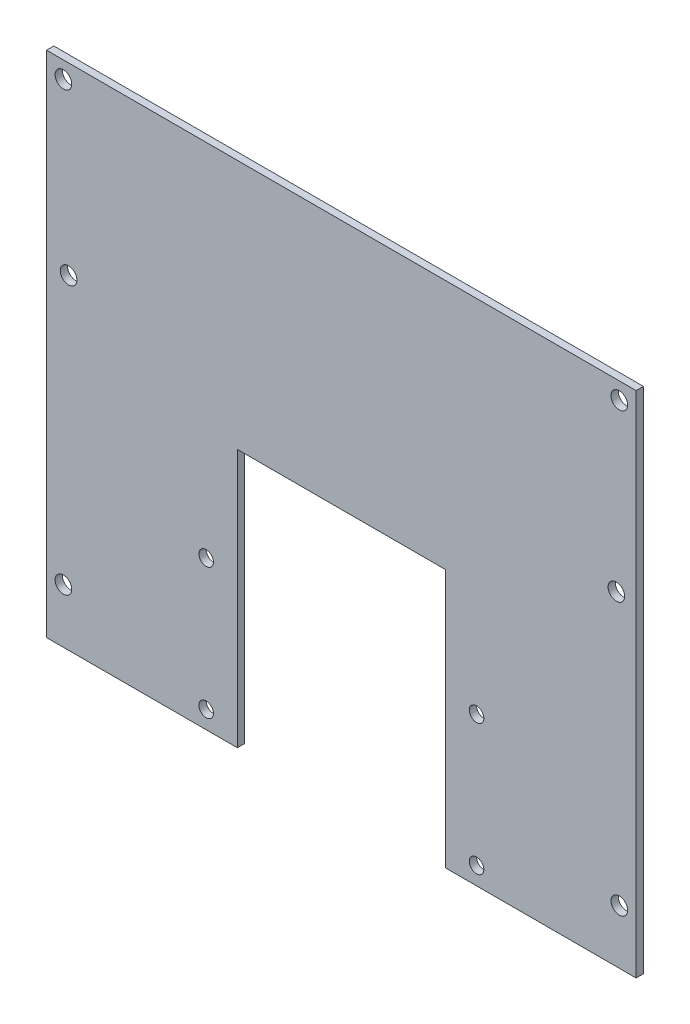
ISO-10303-21;
HEADER;
FILE_DESCRIPTION(('STEP AP214'),'2;1');
FILE_NAME('part.step','',(''),(''),'','','');
FILE_SCHEMA(('AUTOMOTIVE_DESIGN { 1 0 10303 214 1 1 1 1 }'));
ENDSEC;
DATA;
#1=APPLICATION_CONTEXT('core data for automotive mechanical design processes');
#2=APPLICATION_PROTOCOL_DEFINITION('international standard','automotive_design',2000,#1);
#3=PRODUCT_CONTEXT('',#1,'mechanical');
#4=PRODUCT('Part','Part','',(#3));
#5=PRODUCT_RELATED_PRODUCT_CATEGORY('part','',(#4));
#6=PRODUCT_DEFINITION_FORMATION('','',#4);
#7=PRODUCT_DEFINITION_CONTEXT('part definition',#1,'design');
#8=PRODUCT_DEFINITION('design','',#6,#7);
#9=PRODUCT_DEFINITION_SHAPE('','',#8);
#10=(LENGTH_UNIT() NAMED_UNIT(*) SI_UNIT(.MILLI.,.METRE.));
#11=(NAMED_UNIT(*) PLANE_ANGLE_UNIT() SI_UNIT($,.RADIAN.));
#12=(NAMED_UNIT(*) SI_UNIT($,.STERADIAN.) SOLID_ANGLE_UNIT());
#13=UNCERTAINTY_MEASURE_WITH_UNIT(LENGTH_MEASURE(1.E-05),#10,'distance_accuracy_value','');
#14=(GEOMETRIC_REPRESENTATION_CONTEXT(3) GLOBAL_UNCERTAINTY_ASSIGNED_CONTEXT((#13)) GLOBAL_UNIT_ASSIGNED_CONTEXT((#10,
#11,#12)) REPRESENTATION_CONTEXT('',''));
#15=CARTESIAN_POINT('',(0.,0.,0.));
#16=DIRECTION('',(0.,0.,1.));
#17=DIRECTION('',(1.,0.,0.));
#18=AXIS2_PLACEMENT_3D('',#15,#16,#17);
#19=CARTESIAN_POINT('',(45.7634,-134.59778982,-3.5));
#20=DIRECTION('',(0.,-1.,0.));
#21=DIRECTION('',(0.,0.,-1.));
#22=AXIS2_PLACEMENT_3D('',#19,#20,#21);
#23=PLANE('',#22);
#24=DIRECTION('',(1.,0.,0.));
#25=VECTOR('',#24,1.);
#26=CARTESIAN_POINT('',(45.7634,-134.59778982,0.));
#27=LINE('',#26,#25);
#28=CARTESIAN_POINT('',(45.7634,-134.59778982,0.));
#29=VERTEX_POINT('',#28);
#30=CARTESIAN_POINT('',(137.5,-134.59778982,0.));
#31=VERTEX_POINT('',#30);
#32=EDGE_CURVE('E137',#29,#31,#27,.T.);
#33=ORIENTED_EDGE('',*,*,#32,.F.);
#34=DIRECTION('',(0.,0.,1.));
#35=VECTOR('',#34,1.);
#36=CARTESIAN_POINT('',(45.7634,-134.59778982,-3.5));
#37=LINE('',#36,#35);
#38=CARTESIAN_POINT('',(45.7634,-134.59778982,-3.5));
#39=VERTEX_POINT('',#38);
#40=EDGE_CURVE('E11',#39,#29,#37,.T.);
#41=ORIENTED_EDGE('',*,*,#40,.F.);
#42=DIRECTION('',(1.,0.,0.));
#43=VECTOR('',#42,1.);
#44=CARTESIAN_POINT('',(45.7634,-134.59778982,-3.5));
#45=LINE('',#44,#43);
#46=CARTESIAN_POINT('',(137.5,-134.59778982,-3.5));
#47=VERTEX_POINT('',#46);
#48=EDGE_CURVE('E158',#39,#47,#45,.T.);
#49=ORIENTED_EDGE('',*,*,#48,.T.);
#50=DIRECTION('',(0.,0.,1.));
#51=VECTOR('',#50,1.);
#52=CARTESIAN_POINT('',(137.5,-134.59778982,-3.5));
#53=LINE('',#52,#51);
#54=EDGE_CURVE('E43',#47,#31,#53,.T.);
#55=ORIENTED_EDGE('',*,*,#54,.T.);
#56=EDGE_LOOP('',(#33,#41,#49,#55));
#57=FACE_BOUND('',#56,.T.);
#58=ADVANCED_FACE('F40',(#57),#23,.T.);
#59=CARTESIAN_POINT('',(45.7634,-10.36118982,-3.5));
#60=DIRECTION('',(-1.,0.,0.));
#61=DIRECTION('',(0.,-1.,0.));
#62=AXIS2_PLACEMENT_3D('',#59,#60,#61);
#63=PLANE('',#62);
#64=DIRECTION('',(0.,-1.,0.));
#65=VECTOR('',#64,1.);
#66=CARTESIAN_POINT('',(45.7634,-10.36118982,0.));
#67=LINE('',#66,#65);
#68=CARTESIAN_POINT('',(45.7634,-10.36118982,0.));
#69=VERTEX_POINT('',#68);
#70=EDGE_CURVE('E156',#69,#29,#67,.T.);
#71=ORIENTED_EDGE('',*,*,#70,.F.);
#72=DIRECTION('',(0.,0.,1.));
#73=VECTOR('',#72,1.);
#74=CARTESIAN_POINT('',(45.7634,-10.36118982,-3.5));
#75=LINE('',#74,#73);
#76=CARTESIAN_POINT('',(45.7634,-10.36118982,-3.5));
#77=VERTEX_POINT('',#76);
#78=EDGE_CURVE('E49',#77,#69,#75,.T.);
#79=ORIENTED_EDGE('',*,*,#78,.F.);
#80=DIRECTION('',(0.,-1.,0.));
#81=VECTOR('',#80,1.);
#82=CARTESIAN_POINT('',(45.7634,-10.36118982,-3.5));
#83=LINE('',#82,#81);
#84=EDGE_CURVE('E127',#77,#39,#83,.T.);
#85=ORIENTED_EDGE('',*,*,#84,.T.);
#86=ORIENTED_EDGE('',*,*,#40,.T.);
#87=EDGE_LOOP('',(#71,#79,#85,#86));
#88=FACE_BOUND('',#87,.T.);
#89=ADVANCED_FACE('F170',(#88),#63,.T.);
#90=CARTESIAN_POINT('',(-54.2366,-10.36118982,-3.5));
#91=DIRECTION('',(0.,-1.,0.));
#92=DIRECTION('',(1.,0.,0.));
#93=AXIS2_PLACEMENT_3D('',#90,#91,#92);
#94=PLANE('',#93);
#95=DIRECTION('',(1.,0.,0.));
#96=VECTOR('',#95,1.);
#97=CARTESIAN_POINT('',(-54.2366,-10.36118982,0.));
#98=LINE('',#97,#96);
#99=CARTESIAN_POINT('',(-54.2366,-10.36118982,0.));
#100=VERTEX_POINT('',#99);
#101=EDGE_CURVE('E114',#100,#69,#98,.T.);
#102=ORIENTED_EDGE('',*,*,#101,.F.);
#103=DIRECTION('',(0.,0.,1.));
#104=VECTOR('',#103,1.);
#105=CARTESIAN_POINT('',(-54.2366,-10.36118982,-3.5));
#106=LINE('',#105,#104);
#107=CARTESIAN_POINT('',(-54.2366,-10.36118982,-3.5));
#108=VERTEX_POINT('',#107);
#109=EDGE_CURVE('E109',#108,#100,#106,.T.);
#110=ORIENTED_EDGE('',*,*,#109,.F.);
#111=DIRECTION('',(1.,0.,0.));
#112=VECTOR('',#111,1.);
#113=CARTESIAN_POINT('',(-54.2366,-10.36118982,-3.5));
#114=LINE('',#113,#112);
#115=EDGE_CURVE('E112',#108,#77,#114,.T.);
#116=ORIENTED_EDGE('',*,*,#115,.T.);
#117=ORIENTED_EDGE('',*,*,#78,.T.);
#118=EDGE_LOOP('',(#102,#110,#116,#117));
#119=FACE_BOUND('',#118,.T.);
#120=ADVANCED_FACE('F111',(#119),#94,.T.);
#121=CARTESIAN_POINT('',(-54.2366,-134.59778982,-3.5));
#122=DIRECTION('',(1.,0.,0.));
#123=DIRECTION('',(0.,1.,0.));
#124=AXIS2_PLACEMENT_3D('',#121,#122,#123);
#125=PLANE('',#124);
#126=DIRECTION('',(0.,1.,0.));
#127=VECTOR('',#126,1.);
#128=CARTESIAN_POINT('',(-54.2366,-134.59778982,0.));
#129=LINE('',#128,#127);
#130=CARTESIAN_POINT('',(-54.2366,-134.59778982,0.));
#131=VERTEX_POINT('',#130);
#132=EDGE_CURVE('E153',#131,#100,#129,.T.);
#133=ORIENTED_EDGE('',*,*,#132,.F.);
#134=DIRECTION('',(0.,0.,1.));
#135=VECTOR('',#134,1.);
#136=CARTESIAN_POINT('',(-54.2366,-134.59778982,-3.5));
#137=LINE('',#136,#135);
#138=CARTESIAN_POINT('',(-54.2366,-134.59778982,-3.5));
#139=VERTEX_POINT('',#138);
#140=EDGE_CURVE('E119',#139,#131,#137,.T.);
#141=ORIENTED_EDGE('',*,*,#140,.F.);
#142=DIRECTION('',(0.,1.,0.));
#143=VECTOR('',#142,1.);
#144=CARTESIAN_POINT('',(-54.2366,-134.59778982,-3.5));
#145=LINE('',#144,#143);
#146=EDGE_CURVE('E125',#139,#108,#145,.T.);
#147=ORIENTED_EDGE('',*,*,#146,.T.);
#148=ORIENTED_EDGE('',*,*,#109,.T.);
#149=EDGE_LOOP('',(#133,#141,#147,#148));
#150=FACE_BOUND('',#149,.T.);
#151=ADVANCED_FACE('F129',(#150),#125,.T.);
#152=CARTESIAN_POINT('',(-145.9732,-134.59778982,-3.5));
#153=DIRECTION('',(0.,-1.,0.));
#154=DIRECTION('',(1.,0.,0.));
#155=AXIS2_PLACEMENT_3D('',#152,#153,#154);
#156=PLANE('',#155);
#157=DIRECTION('',(1.,0.,0.));
#158=VECTOR('',#157,1.);
#159=CARTESIAN_POINT('',(-145.9732,-134.59778982,0.));
#160=LINE('',#159,#158);
#161=CARTESIAN_POINT('',(-145.9732,-134.59778982,0.));
#162=VERTEX_POINT('',#161);
#163=EDGE_CURVE('E150',#162,#131,#160,.T.);
#164=ORIENTED_EDGE('',*,*,#163,.F.);
#165=DIRECTION('',(0.,0.,1.));
#166=VECTOR('',#165,1.);
#167=CARTESIAN_POINT('',(-145.9732,-134.59778982,-3.5));
#168=LINE('',#167,#166);
#169=CARTESIAN_POINT('',(-145.9732,-134.59778982,-3.5));
#170=VERTEX_POINT('',#169);
#171=EDGE_CURVE('E162',#170,#162,#168,.T.);
#172=ORIENTED_EDGE('',*,*,#171,.F.);
#173=DIRECTION('',(1.,0.,0.));
#174=VECTOR('',#173,1.);
#175=CARTESIAN_POINT('',(-145.9732,-134.59778982,-3.5));
#176=LINE('',#175,#174);
#177=EDGE_CURVE('E130',#170,#139,#176,.T.);
#178=ORIENTED_EDGE('',*,*,#177,.T.);
#179=ORIENTED_EDGE('',*,*,#140,.T.);
#180=EDGE_LOOP('',(#164,#172,#178,#179));
#181=FACE_BOUND('',#180,.T.);
#182=ADVANCED_FACE('F183',(#181),#156,.T.);
#183=CARTESIAN_POINT('',(-145.9732,110.,-3.5));
#184=DIRECTION('',(-1.,0.,0.));
#185=DIRECTION('',(0.,-1.,0.));
#186=AXIS2_PLACEMENT_3D('',#183,#184,#185);
#187=PLANE('',#186);
#188=DIRECTION('',(0.,-1.,0.));
#189=VECTOR('',#188,1.);
#190=CARTESIAN_POINT('',(-145.9732,110.,0.));
#191=LINE('',#190,#189);
#192=CARTESIAN_POINT('',(-145.9732,110.,0.));
#193=VERTEX_POINT('',#192);
#194=EDGE_CURVE('E147',#193,#162,#191,.T.);
#195=ORIENTED_EDGE('',*,*,#194,.F.);
#196=DIRECTION('',(0.,0.,1.));
#197=VECTOR('',#196,1.);
#198=CARTESIAN_POINT('',(-145.9732,110.,-3.5));
#199=LINE('',#198,#197);
#200=CARTESIAN_POINT('',(-145.9732,110.,-3.5));
#201=VERTEX_POINT('',#200);
#202=EDGE_CURVE('E164',#201,#193,#199,.T.);
#203=ORIENTED_EDGE('',*,*,#202,.F.);
#204=DIRECTION('',(0.,-1.,0.));
#205=VECTOR('',#204,1.);
#206=CARTESIAN_POINT('',(-145.9732,110.,-3.5));
#207=LINE('',#206,#205);
#208=EDGE_CURVE('E132',#201,#170,#207,.T.);
#209=ORIENTED_EDGE('',*,*,#208,.T.);
#210=ORIENTED_EDGE('',*,*,#171,.T.);
#211=EDGE_LOOP('',(#195,#203,#209,#210));
#212=FACE_BOUND('',#211,.T.);
#213=ADVANCED_FACE('F186',(#212),#187,.T.);
#214=CARTESIAN_POINT('',(-145.9732,110.,-3.5));
#215=DIRECTION('',(0.,1.,0.));
#216=DIRECTION('',(0.,0.,1.));
#217=AXIS2_PLACEMENT_3D('',#214,#215,#216);
#218=PLANE('',#217);
#219=DIRECTION('',(-1.,0.,0.));
#220=VECTOR('',#219,1.);
#221=CARTESIAN_POINT('',(-145.9732,110.,0.));
#222=LINE('',#221,#220);
#223=CARTESIAN_POINT('',(137.5,110.,0.));
#224=VERTEX_POINT('',#223);
#225=EDGE_CURVE('E144',#224,#193,#222,.T.);
#226=ORIENTED_EDGE('',*,*,#225,.F.);
#227=DIRECTION('',(0.,0.,1.));
#228=VECTOR('',#227,1.);
#229=CARTESIAN_POINT('',(137.5,110.,-3.5));
#230=LINE('',#229,#228);
#231=CARTESIAN_POINT('',(137.5,110.,-3.5));
#232=VERTEX_POINT('',#231);
#233=EDGE_CURVE('E165',#232,#224,#230,.T.);
#234=ORIENTED_EDGE('',*,*,#233,.F.);
#235=DIRECTION('',(-1.,0.,0.));
#236=VECTOR('',#235,1.);
#237=CARTESIAN_POINT('',(-145.9732,110.,-3.5));
#238=LINE('',#237,#236);
#239=EDGE_CURVE('E313',#232,#201,#238,.T.);
#240=ORIENTED_EDGE('',*,*,#239,.T.);
#241=ORIENTED_EDGE('',*,*,#202,.T.);
#242=EDGE_LOOP('',(#226,#234,#240,#241));
#243=FACE_BOUND('',#242,.T.);
#244=ADVANCED_FACE('F190',(#243),#218,.T.);
#245=CARTESIAN_POINT('',(137.5,110.,-3.5));
#246=DIRECTION('',(1.,0.,0.));
#247=DIRECTION('',(0.,0.,-1.));
#248=AXIS2_PLACEMENT_3D('',#245,#246,#247);
#249=PLANE('',#248);
#250=DIRECTION('',(0.,1.,0.));
#251=VECTOR('',#250,1.);
#252=CARTESIAN_POINT('',(137.5,110.,0.));
#253=LINE('',#252,#251);
#254=EDGE_CURVE('E140',#31,#224,#253,.T.);
#255=ORIENTED_EDGE('',*,*,#254,.F.);
#256=ORIENTED_EDGE('',*,*,#54,.F.);
#257=DIRECTION('',(0.,1.,0.));
#258=VECTOR('',#257,1.);
#259=CARTESIAN_POINT('',(137.5,110.,-3.5));
#260=LINE('',#259,#258);
#261=EDGE_CURVE('E311',#47,#232,#260,.T.);
#262=ORIENTED_EDGE('',*,*,#261,.T.);
#263=ORIENTED_EDGE('',*,*,#233,.T.);
#264=EDGE_LOOP('',(#255,#256,#262,#263));
#265=FACE_BOUND('',#264,.T.);
#266=ADVANCED_FACE('F167',(#265),#249,.T.);
#267=CARTESIAN_POINT('',(0.,0.,-3.5));
#268=DIRECTION('',(0.,0.,-1.));
#269=DIRECTION('',(-1.,0.,0.));
#270=AXIS2_PLACEMENT_3D('',#267,#268,#269);
#271=PLANE('',#270);
#272=CARTESIAN_POINT('',(-135.388469701049,21.5323032569426,-3.5));
#273=DIRECTION('',(0.,0.,1.));
#274=DIRECTION('',(1.,0.,0.));
#275=AXIS2_PLACEMENT_3D('',#272,#273,#274);
#276=CIRCLE('',#275,3.99999999999998);
#277=CARTESIAN_POINT('',(-131.388469701049,21.5323032569426,-3.5));
#278=VERTEX_POINT('',#277);
#279=EDGE_CURVE('E250',#278,#278,#276,.T.);
#280=ORIENTED_EDGE('',*,*,#279,.T.);
#281=EDGE_LOOP('',(#280));
#282=FACE_BOUND('',#281,.T.);
#283=CARTESIAN_POINT('',(127.977228160168,21.5323032569426,-3.5));
#284=DIRECTION('',(0.,0.,1.));
#285=DIRECTION('',(1.,0.,0.));
#286=AXIS2_PLACEMENT_3D('',#283,#284,#285);
#287=CIRCLE('',#286,3.99999999999998);
#288=CARTESIAN_POINT('',(131.977228160168,21.5323032569426,-3.5));
#289=VERTEX_POINT('',#288);
#290=EDGE_CURVE('E260',#289,#289,#287,.T.);
#291=ORIENTED_EDGE('',*,*,#290,.T.);
#292=EDGE_LOOP('',(#291));
#293=FACE_BOUND('',#292,.T.);
#294=CARTESIAN_POINT('',(-137.8732,-108.47319982,-3.5));
#295=DIRECTION('',(0.,0.,-1.));
#296=DIRECTION('',(-1.,0.,0.));
#297=AXIS2_PLACEMENT_3D('',#294,#295,#296);
#298=CIRCLE('',#297,3.99999999999999);
#299=CARTESIAN_POINT('',(-141.8732,-108.47319982,-3.5));
#300=VERTEX_POINT('',#299);
#301=EDGE_CURVE('E275',#300,#300,#298,.T.);
#302=ORIENTED_EDGE('',*,*,#301,.F.);
#303=EDGE_LOOP('',(#302));
#304=FACE_BOUND('',#303,.T.);
#305=CARTESIAN_POINT('',(129.4,-108.47319982,-3.5));
#306=DIRECTION('',(0.,0.,-1.));
#307=DIRECTION('',(-1.,0.,0.));
#308=AXIS2_PLACEMENT_3D('',#305,#306,#307);
#309=CIRCLE('',#308,3.99999999999999);
#310=CARTESIAN_POINT('',(125.4,-108.47319982,-3.5));
#311=VERTEX_POINT('',#310);
#312=EDGE_CURVE('E268',#311,#311,#309,.T.);
#313=ORIENTED_EDGE('',*,*,#312,.F.);
#314=EDGE_LOOP('',(#313));
#315=FACE_BOUND('',#314,.T.);
#316=CARTESIAN_POINT('',(129.4,101.9,-3.5));
#317=DIRECTION('',(0.,0.,-1.));
#318=DIRECTION('',(-1.,0.,0.));
#319=AXIS2_PLACEMENT_3D('',#316,#317,#318);
#320=CIRCLE('',#319,3.99999999999999);
#321=CARTESIAN_POINT('',(125.4,101.9,-3.5));
#322=VERTEX_POINT('',#321);
#323=EDGE_CURVE('E267',#322,#322,#320,.T.);
#324=ORIENTED_EDGE('',*,*,#323,.F.);
#325=EDGE_LOOP('',(#324));
#326=FACE_BOUND('',#325,.T.);
#327=CARTESIAN_POINT('',(-137.8732,101.9,-3.5));
#328=DIRECTION('',(0.,0.,-1.));
#329=DIRECTION('',(-1.,0.,0.));
#330=AXIS2_PLACEMENT_3D('',#327,#328,#329);
#331=CIRCLE('',#330,3.99999999999999);
#332=CARTESIAN_POINT('',(-141.8732,101.9,-3.5));
#333=VERTEX_POINT('',#332);
#334=EDGE_CURVE('E271',#333,#333,#331,.T.);
#335=ORIENTED_EDGE('',*,*,#334,.F.);
#336=EDGE_LOOP('',(#335));
#337=FACE_BOUND('',#336,.T.);
#338=CARTESIAN_POINT('',(-69.2366,-126.09778982,-3.5));
#339=DIRECTION('',(0.,0.,-1.));
#340=DIRECTION('',(-1.,0.,0.));
#341=AXIS2_PLACEMENT_3D('',#338,#339,#340);
#342=CIRCLE('',#341,3.50000000000001);
#343=CARTESIAN_POINT('',(-72.7366,-126.09778982,-3.5));
#344=VERTEX_POINT('',#343);
#345=EDGE_CURVE('E297',#344,#344,#342,.T.);
#346=ORIENTED_EDGE('',*,*,#345,.F.);
#347=EDGE_LOOP('',(#346));
#348=FACE_BOUND('',#347,.T.);
#349=CARTESIAN_POINT('',(60.7634,-63.09778982,-3.5));
#350=DIRECTION('',(0.,0.,-1.));
#351=DIRECTION('',(-1.,0.,0.));
#352=AXIS2_PLACEMENT_3D('',#349,#350,#351);
#353=CIRCLE('',#352,3.5);
#354=CARTESIAN_POINT('',(57.2634,-63.09778982,-3.5));
#355=VERTEX_POINT('',#354);
#356=EDGE_CURVE('E298',#355,#355,#353,.T.);
#357=ORIENTED_EDGE('',*,*,#356,.F.);
#358=EDGE_LOOP('',(#357));
#359=FACE_BOUND('',#358,.T.);
#360=CARTESIAN_POINT('',(-69.2366,-63.09778982,-3.5));
#361=DIRECTION('',(0.,0.,-1.));
#362=DIRECTION('',(-1.,0.,0.));
#363=AXIS2_PLACEMENT_3D('',#360,#361,#362);
#364=CIRCLE('',#363,3.50000000000001);
#365=CARTESIAN_POINT('',(-72.7366,-63.09778982,-3.5));
#366=VERTEX_POINT('',#365);
#367=EDGE_CURVE('E290',#366,#366,#364,.T.);
#368=ORIENTED_EDGE('',*,*,#367,.F.);
#369=EDGE_LOOP('',(#368));
#370=FACE_BOUND('',#369,.T.);
#371=CARTESIAN_POINT('',(60.7634,-126.09778982,-3.5));
#372=DIRECTION('',(0.,0.,-1.));
#373=DIRECTION('',(-1.,0.,0.));
#374=AXIS2_PLACEMENT_3D('',#371,#372,#373);
#375=CIRCLE('',#374,3.5);
#376=CARTESIAN_POINT('',(57.2634,-126.09778982,-3.5));
#377=VERTEX_POINT('',#376);
#378=EDGE_CURVE('E301',#377,#377,#375,.T.);
#379=ORIENTED_EDGE('',*,*,#378,.F.);
#380=EDGE_LOOP('',(#379));
#381=FACE_BOUND('',#380,.T.);
#382=ORIENTED_EDGE('',*,*,#48,.F.);
#383=ORIENTED_EDGE('',*,*,#84,.F.);
#384=ORIENTED_EDGE('',*,*,#115,.F.);
#385=ORIENTED_EDGE('',*,*,#146,.F.);
#386=ORIENTED_EDGE('',*,*,#177,.F.);
#387=ORIENTED_EDGE('',*,*,#208,.F.);
#388=ORIENTED_EDGE('',*,*,#239,.F.);
#389=ORIENTED_EDGE('',*,*,#261,.F.);
#390=EDGE_LOOP('',(#382,#383,#384,#385,#386,#387,#388,#389));
#391=FACE_BOUND('',#390,.T.);
#392=ADVANCED_FACE('F123',(#282,#293,#304,#315,#326,#337,#348,#359,#370,#381,#391),#271,.T.);
#393=CARTESIAN_POINT('',(0.,0.,0.));
#394=DIRECTION('',(0.,0.,-1.));
#395=DIRECTION('',(-1.,0.,0.));
#396=AXIS2_PLACEMENT_3D('',#393,#394,#395);
#397=PLANE('',#396);
#398=CARTESIAN_POINT('',(-135.388469701049,21.5323032569426,0.));
#399=DIRECTION('',(0.,0.,1.));
#400=DIRECTION('',(1.,0.,0.));
#401=AXIS2_PLACEMENT_3D('',#398,#399,#400);
#402=CIRCLE('',#401,3.99999999999998);
#403=CARTESIAN_POINT('',(-131.388469701049,21.5323032569426,0.));
#404=VERTEX_POINT('',#403);
#405=EDGE_CURVE('E253',#404,#404,#402,.T.);
#406=ORIENTED_EDGE('',*,*,#405,.F.);
#407=EDGE_LOOP('',(#406));
#408=FACE_BOUND('',#407,.T.);
#409=CARTESIAN_POINT('',(127.977228160168,21.5323032569426,0.));
#410=DIRECTION('',(0.,0.,1.));
#411=DIRECTION('',(1.,0.,0.));
#412=AXIS2_PLACEMENT_3D('',#409,#410,#411);
#413=CIRCLE('',#412,3.99999999999998);
#414=CARTESIAN_POINT('',(131.977228160168,21.5323032569426,0.));
#415=VERTEX_POINT('',#414);
#416=EDGE_CURVE('E255',#415,#415,#413,.T.);
#417=ORIENTED_EDGE('',*,*,#416,.F.);
#418=EDGE_LOOP('',(#417));
#419=FACE_BOUND('',#418,.T.);
#420=CARTESIAN_POINT('',(-137.8732,-108.47319982,0.));
#421=DIRECTION('',(0.,0.,-1.));
#422=DIRECTION('',(-1.,0.,0.));
#423=AXIS2_PLACEMENT_3D('',#420,#421,#422);
#424=CIRCLE('',#423,3.99999999999999);
#425=CARTESIAN_POINT('',(-141.8732,-108.47319982,0.));
#426=VERTEX_POINT('',#425);
#427=EDGE_CURVE('E263',#426,#426,#424,.F.);
#428=ORIENTED_EDGE('',*,*,#427,.F.);
#429=EDGE_LOOP('',(#428));
#430=FACE_BOUND('',#429,.T.);
#431=CARTESIAN_POINT('',(129.4,-108.47319982,0.));
#432=DIRECTION('',(0.,0.,-1.));
#433=DIRECTION('',(-1.,0.,0.));
#434=AXIS2_PLACEMENT_3D('',#431,#432,#433);
#435=CIRCLE('',#434,3.99999999999999);
#436=CARTESIAN_POINT('',(125.4,-108.47319982,0.));
#437=VERTEX_POINT('',#436);
#438=EDGE_CURVE('E272',#437,#437,#435,.F.);
#439=ORIENTED_EDGE('',*,*,#438,.F.);
#440=EDGE_LOOP('',(#439));
#441=FACE_BOUND('',#440,.T.);
#442=CARTESIAN_POINT('',(129.4,101.9,0.));
#443=DIRECTION('',(0.,0.,-1.));
#444=DIRECTION('',(-1.,0.,0.));
#445=AXIS2_PLACEMENT_3D('',#442,#443,#444);
#446=CIRCLE('',#445,3.99999999999999);
#447=CARTESIAN_POINT('',(125.4,101.9,0.));
#448=VERTEX_POINT('',#447);
#449=EDGE_CURVE('E264',#448,#448,#446,.F.);
#450=ORIENTED_EDGE('',*,*,#449,.F.);
#451=EDGE_LOOP('',(#450));
#452=FACE_BOUND('',#451,.T.);
#453=CARTESIAN_POINT('',(-137.8732,101.9,0.));
#454=DIRECTION('',(0.,0.,-1.));
#455=DIRECTION('',(-1.,0.,0.));
#456=AXIS2_PLACEMENT_3D('',#453,#454,#455);
#457=CIRCLE('',#456,3.99999999999999);
#458=CARTESIAN_POINT('',(-141.8732,101.9,0.));
#459=VERTEX_POINT('',#458);
#460=EDGE_CURVE('E284',#459,#459,#457,.F.);
#461=ORIENTED_EDGE('',*,*,#460,.F.);
#462=EDGE_LOOP('',(#461));
#463=FACE_BOUND('',#462,.T.);
#464=CARTESIAN_POINT('',(-69.2366,-126.09778982,0.));
#465=DIRECTION('',(0.,0.,-1.));
#466=DIRECTION('',(-1.,0.,0.));
#467=AXIS2_PLACEMENT_3D('',#464,#465,#466);
#468=CIRCLE('',#467,3.50000000000001);
#469=CARTESIAN_POINT('',(-72.7366,-126.09778982,0.));
#470=VERTEX_POINT('',#469);
#471=EDGE_CURVE('E294',#470,#470,#468,.F.);
#472=ORIENTED_EDGE('',*,*,#471,.F.);
#473=EDGE_LOOP('',(#472));
#474=FACE_BOUND('',#473,.T.);
#475=CARTESIAN_POINT('',(60.7634,-63.09778982,0.));
#476=DIRECTION('',(0.,0.,-1.));
#477=DIRECTION('',(-1.,0.,0.));
#478=AXIS2_PLACEMENT_3D('',#475,#476,#477);
#479=CIRCLE('',#478,3.5);
#480=CARTESIAN_POINT('',(57.2634,-63.09778982,0.));
#481=VERTEX_POINT('',#480);
#482=EDGE_CURVE('E293',#481,#481,#479,.F.);
#483=ORIENTED_EDGE('',*,*,#482,.F.);
#484=EDGE_LOOP('',(#483));
#485=FACE_BOUND('',#484,.T.);
#486=CARTESIAN_POINT('',(-69.2366,-63.09778982,0.));
#487=DIRECTION('',(0.,0.,-1.));
#488=DIRECTION('',(-1.,0.,0.));
#489=AXIS2_PLACEMENT_3D('',#486,#487,#488);
#490=CIRCLE('',#489,3.50000000000001);
#491=CARTESIAN_POINT('',(-72.7366,-63.09778982,0.));
#492=VERTEX_POINT('',#491);
#493=EDGE_CURVE('E287',#492,#492,#490,.F.);
#494=ORIENTED_EDGE('',*,*,#493,.F.);
#495=EDGE_LOOP('',(#494));
#496=FACE_BOUND('',#495,.T.);
#497=CARTESIAN_POINT('',(60.7634,-126.09778982,0.));
#498=DIRECTION('',(0.,0.,-1.));
#499=DIRECTION('',(-1.,0.,0.));
#500=AXIS2_PLACEMENT_3D('',#497,#498,#499);
#501=CIRCLE('',#500,3.5);
#502=CARTESIAN_POINT('',(57.2634,-126.09778982,0.));
#503=VERTEX_POINT('',#502);
#504=EDGE_CURVE('E141',#503,#503,#501,.F.);
#505=ORIENTED_EDGE('',*,*,#504,.F.);
#506=EDGE_LOOP('',(#505));
#507=FACE_BOUND('',#506,.T.);
#508=ORIENTED_EDGE('',*,*,#32,.T.);
#509=ORIENTED_EDGE('',*,*,#254,.T.);
#510=ORIENTED_EDGE('',*,*,#225,.T.);
#511=ORIENTED_EDGE('',*,*,#194,.T.);
#512=ORIENTED_EDGE('',*,*,#163,.T.);
#513=ORIENTED_EDGE('',*,*,#132,.T.);
#514=ORIENTED_EDGE('',*,*,#101,.T.);
#515=ORIENTED_EDGE('',*,*,#70,.T.);
#516=EDGE_LOOP('',(#508,#509,#510,#511,#512,#513,#514,#515));
#517=FACE_BOUND('',#516,.T.);
#518=ADVANCED_FACE('F169',(#408,#419,#430,#441,#452,#463,#474,#485,#496,#507,#517),#397,.F.);
#519=CARTESIAN_POINT('',(60.7634,-126.09778982,9.89949493661168));
#520=DIRECTION('',(0.,0.,-1.));
#521=DIRECTION('',(-1.,0.,0.));
#522=AXIS2_PLACEMENT_3D('',#519,#520,#521);
#523=CYLINDRICAL_SURFACE('',#522,3.5);
#524=ORIENTED_EDGE('',*,*,#504,.T.);
#525=EDGE_LOOP('',(#524));
#526=FACE_BOUND('',#525,.T.);
#527=ORIENTED_EDGE('',*,*,#378,.T.);
#528=EDGE_LOOP('',(#527));
#529=FACE_BOUND('',#528,.T.);
#530=ADVANCED_FACE('F203',(#526,#529),#523,.F.);
#531=CARTESIAN_POINT('',(-69.2366,-63.09778982,9.89949493661168));
#532=DIRECTION('',(0.,0.,-1.));
#533=DIRECTION('',(-1.,0.,0.));
#534=AXIS2_PLACEMENT_3D('',#531,#532,#533);
#535=CYLINDRICAL_SURFACE('',#534,3.50000000000001);
#536=ORIENTED_EDGE('',*,*,#493,.T.);
#537=EDGE_LOOP('',(#536));
#538=FACE_BOUND('',#537,.T.);
#539=ORIENTED_EDGE('',*,*,#367,.T.);
#540=EDGE_LOOP('',(#539));
#541=FACE_BOUND('',#540,.T.);
#542=ADVANCED_FACE('F210',(#538,#541),#535,.F.);
#543=CARTESIAN_POINT('',(60.7634,-63.09778982,9.89949493661168));
#544=DIRECTION('',(0.,0.,-1.));
#545=DIRECTION('',(-1.,0.,0.));
#546=AXIS2_PLACEMENT_3D('',#543,#544,#545);
#547=CYLINDRICAL_SURFACE('',#546,3.5);
#548=ORIENTED_EDGE('',*,*,#482,.T.);
#549=EDGE_LOOP('',(#548));
#550=FACE_BOUND('',#549,.T.);
#551=ORIENTED_EDGE('',*,*,#356,.T.);
#552=EDGE_LOOP('',(#551));
#553=FACE_BOUND('',#552,.T.);
#554=ADVANCED_FACE('F212',(#550,#553),#547,.F.);
#555=CARTESIAN_POINT('',(-69.2366,-126.09778982,9.89949493661168));
#556=DIRECTION('',(0.,0.,-1.));
#557=DIRECTION('',(-1.,0.,0.));
#558=AXIS2_PLACEMENT_3D('',#555,#556,#557);
#559=CYLINDRICAL_SURFACE('',#558,3.50000000000001);
#560=ORIENTED_EDGE('',*,*,#471,.T.);
#561=EDGE_LOOP('',(#560));
#562=FACE_BOUND('',#561,.T.);
#563=ORIENTED_EDGE('',*,*,#345,.T.);
#564=EDGE_LOOP('',(#563));
#565=FACE_BOUND('',#564,.T.);
#566=ADVANCED_FACE('F215',(#562,#565),#559,.F.);
#567=CARTESIAN_POINT('',(-137.8732,101.9,11.3137084989848));
#568=DIRECTION('',(0.,0.,-1.));
#569=DIRECTION('',(-1.,0.,0.));
#570=AXIS2_PLACEMENT_3D('',#567,#568,#569);
#571=CYLINDRICAL_SURFACE('',#570,3.99999999999999);
#572=ORIENTED_EDGE('',*,*,#460,.T.);
#573=EDGE_LOOP('',(#572));
#574=FACE_BOUND('',#573,.T.);
#575=ORIENTED_EDGE('',*,*,#334,.T.);
#576=EDGE_LOOP('',(#575));
#577=FACE_BOUND('',#576,.T.);
#578=ADVANCED_FACE('F219',(#574,#577),#571,.F.);
#579=CARTESIAN_POINT('',(129.4,101.9,11.3137084989848));
#580=DIRECTION('',(0.,0.,-1.));
#581=DIRECTION('',(-1.,0.,0.));
#582=AXIS2_PLACEMENT_3D('',#579,#580,#581);
#583=CYLINDRICAL_SURFACE('',#582,3.99999999999999);
#584=ORIENTED_EDGE('',*,*,#449,.T.);
#585=EDGE_LOOP('',(#584));
#586=FACE_BOUND('',#585,.T.);
#587=ORIENTED_EDGE('',*,*,#323,.T.);
#588=EDGE_LOOP('',(#587));
#589=FACE_BOUND('',#588,.T.);
#590=ADVANCED_FACE('F226',(#586,#589),#583,.F.);
#591=CARTESIAN_POINT('',(129.4,-108.47319982,11.3137084989848));
#592=DIRECTION('',(0.,0.,-1.));
#593=DIRECTION('',(-1.,0.,0.));
#594=AXIS2_PLACEMENT_3D('',#591,#592,#593);
#595=CYLINDRICAL_SURFACE('',#594,3.99999999999999);
#596=ORIENTED_EDGE('',*,*,#438,.T.);
#597=EDGE_LOOP('',(#596));
#598=FACE_BOUND('',#597,.T.);
#599=ORIENTED_EDGE('',*,*,#312,.T.);
#600=EDGE_LOOP('',(#599));
#601=FACE_BOUND('',#600,.T.);
#602=ADVANCED_FACE('F232',(#598,#601),#595,.F.);
#603=CARTESIAN_POINT('',(-137.8732,-108.47319982,11.3137084989848));
#604=DIRECTION('',(0.,0.,-1.));
#605=DIRECTION('',(-1.,0.,0.));
#606=AXIS2_PLACEMENT_3D('',#603,#604,#605);
#607=CYLINDRICAL_SURFACE('',#606,3.99999999999999);
#608=ORIENTED_EDGE('',*,*,#427,.T.);
#609=EDGE_LOOP('',(#608));
#610=FACE_BOUND('',#609,.T.);
#611=ORIENTED_EDGE('',*,*,#301,.T.);
#612=EDGE_LOOP('',(#611));
#613=FACE_BOUND('',#612,.T.);
#614=ADVANCED_FACE('F228',(#610,#613),#607,.F.);
#615=CARTESIAN_POINT('',(127.977228160168,21.5323032569426,0.));
#616=DIRECTION('',(0.,0.,1.));
#617=DIRECTION('',(1.,0.,0.));
#618=AXIS2_PLACEMENT_3D('',#615,#616,#617);
#619=CYLINDRICAL_SURFACE('',#618,3.99999999999998);
#620=ORIENTED_EDGE('',*,*,#290,.F.);
#621=EDGE_LOOP('',(#620));
#622=FACE_BOUND('',#621,.T.);
#623=ORIENTED_EDGE('',*,*,#416,.T.);
#624=EDGE_LOOP('',(#623));
#625=FACE_BOUND('',#624,.T.);
#626=ADVANCED_FACE('F231',(#622,#625),#619,.F.);
#627=CARTESIAN_POINT('',(-135.388469701049,21.5323032569426,0.));
#628=DIRECTION('',(0.,0.,1.));
#629=DIRECTION('',(1.,0.,0.));
#630=AXIS2_PLACEMENT_3D('',#627,#628,#629);
#631=CYLINDRICAL_SURFACE('',#630,3.99999999999998);
#632=ORIENTED_EDGE('',*,*,#279,.F.);
#633=EDGE_LOOP('',(#632));
#634=FACE_BOUND('',#633,.T.);
#635=ORIENTED_EDGE('',*,*,#405,.T.);
#636=EDGE_LOOP('',(#635));
#637=FACE_BOUND('',#636,.T.);
#638=ADVANCED_FACE('F242',(#634,#637),#631,.F.);
#639=CLOSED_SHELL('',(#58,#89,#120,#151,#182,#213,#244,#266,#392,#518,#530,#542,#554,#566,#578,
#590,#602,#614,#626,#638));
#640=MANIFOLD_SOLID_BREP('B2',#639);
#641=ADVANCED_BREP_SHAPE_REPRESENTATION('',(#18,#640),#14);
#642=SHAPE_DEFINITION_REPRESENTATION(#9,#641);
ENDSEC;
END-ISO-10303-21;
